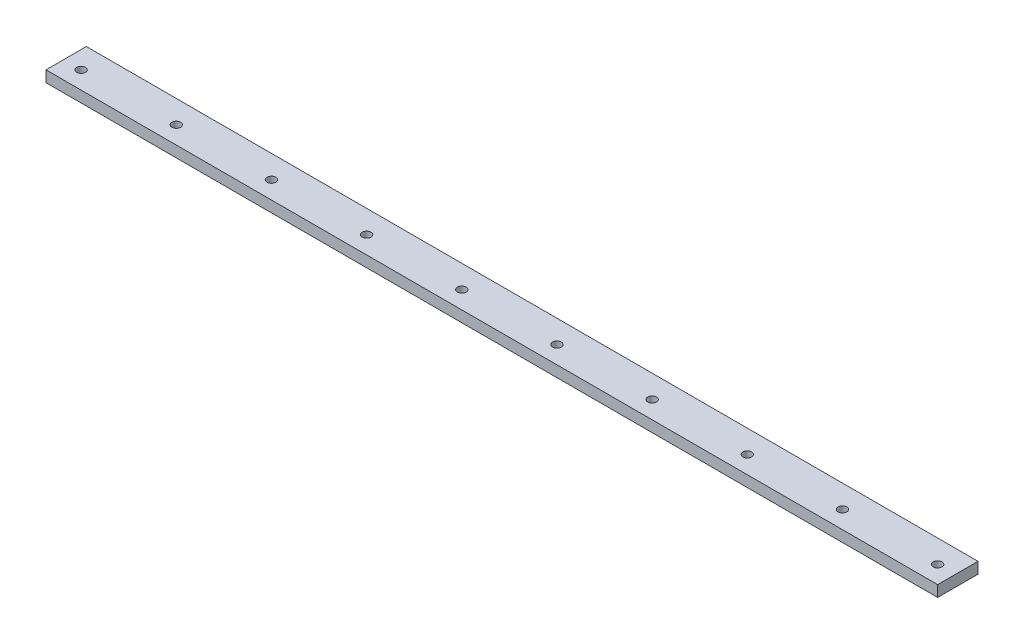
ISO-10303-21;
HEADER;
FILE_DESCRIPTION(('STEP AP214'),'2;1');
FILE_NAME('part.step','',(''),(''),'','','');
FILE_SCHEMA(('AUTOMOTIVE_DESIGN { 1 0 10303 214 1 1 1 1 }'));
ENDSEC;
DATA;
#1=APPLICATION_CONTEXT('core data for automotive mechanical design processes');
#2=APPLICATION_PROTOCOL_DEFINITION('international standard','automotive_design',2000,#1);
#3=PRODUCT_CONTEXT('',#1,'mechanical');
#4=PRODUCT('Part','Part','',(#3));
#5=PRODUCT_RELATED_PRODUCT_CATEGORY('part','',(#4));
#6=PRODUCT_DEFINITION_FORMATION('','',#4);
#7=PRODUCT_DEFINITION_CONTEXT('part definition',#1,'design');
#8=PRODUCT_DEFINITION('design','',#6,#7);
#9=PRODUCT_DEFINITION_SHAPE('','',#8);
#10=(LENGTH_UNIT() NAMED_UNIT(*) SI_UNIT(.MILLI.,.METRE.));
#11=(NAMED_UNIT(*) PLANE_ANGLE_UNIT() SI_UNIT($,.RADIAN.));
#12=(NAMED_UNIT(*) SI_UNIT($,.STERADIAN.) SOLID_ANGLE_UNIT());
#13=UNCERTAINTY_MEASURE_WITH_UNIT(LENGTH_MEASURE(1.E-05),#10,'distance_accuracy_value','');
#14=(GEOMETRIC_REPRESENTATION_CONTEXT(3) GLOBAL_UNCERTAINTY_ASSIGNED_CONTEXT((#13)) GLOBAL_UNIT_ASSIGNED_CONTEXT((#10,
#11,#12)) REPRESENTATION_CONTEXT('',''));
#15=CARTESIAN_POINT('',(0.,0.,0.));
#16=DIRECTION('',(0.,0.,1.));
#17=DIRECTION('',(1.,0.,0.));
#18=AXIS2_PLACEMENT_3D('',#15,#16,#17);
#19=CARTESIAN_POINT('',(0.,3.175,0.));
#20=DIRECTION('',(0.,-1.,0.));
#21=DIRECTION('',(0.,0.,-1.));
#22=AXIS2_PLACEMENT_3D('',#19,#20,#21);
#23=PLANE('',#22);
#24=DIRECTION('',(0.,0.,1.));
#25=VECTOR('',#24,1.);
#26=CARTESIAN_POINT('',(-254.,3.175,10.));
#27=LINE('',#26,#25);
#28=CARTESIAN_POINT('',(-254.,3.175,-13.));
#29=VERTEX_POINT('',#28);
#30=CARTESIAN_POINT('',(-254.,3.175,10.));
#31=VERTEX_POINT('',#30);
#32=EDGE_CURVE('E85',#29,#31,#27,.T.);
#33=ORIENTED_EDGE('',*,*,#32,.T.);
#34=DIRECTION('',(1.,0.,0.));
#35=VECTOR('',#34,1.);
#36=CARTESIAN_POINT('',(-254.,3.175,10.));
#37=LINE('',#36,#35);
#38=CARTESIAN_POINT('',(254.,3.175,10.0000000000001));
#39=VERTEX_POINT('',#38);
#40=EDGE_CURVE('E80',#31,#39,#37,.T.);
#41=ORIENTED_EDGE('',*,*,#40,.T.);
#42=DIRECTION('',(0.,0.,-1.));
#43=VECTOR('',#42,1.);
#44=CARTESIAN_POINT('',(254.,3.175,10.0000000000001));
#45=LINE('',#44,#43);
#46=CARTESIAN_POINT('',(254.,3.175,-13.));
#47=VERTEX_POINT('',#46);
#48=EDGE_CURVE('E83',#39,#47,#45,.T.);
#49=ORIENTED_EDGE('',*,*,#48,.T.);
#50=DIRECTION('',(-1.,0.,0.));
#51=VECTOR('',#50,1.);
#52=CARTESIAN_POINT('',(-254.,3.175,-13.));
#53=LINE('',#52,#51);
#54=EDGE_CURVE('E50',#47,#29,#53,.T.);
#55=ORIENTED_EDGE('',*,*,#54,.T.);
#56=EDGE_LOOP('',(#33,#41,#49,#55));
#57=FACE_BOUND('',#56,.T.);
#58=CARTESIAN_POINT('',(-244.,3.175,0.));
#59=DIRECTION('',(0.,1.,0.));
#60=DIRECTION('',(0.,0.,1.));
#61=AXIS2_PLACEMENT_3D('',#58,#59,#60);
#62=CIRCLE('',#61,2.5);
#63=CARTESIAN_POINT('',(-244.,3.175,2.49999999999999));
#64=VERTEX_POINT('',#63);
#65=EDGE_CURVE('E100',#64,#64,#62,.T.);
#66=ORIENTED_EDGE('',*,*,#65,.F.);
#67=EDGE_LOOP('',(#66));
#68=FACE_BOUND('',#67,.T.);
#69=CARTESIAN_POINT('',(-189.777777777778,3.175,0.));
#70=DIRECTION('',(0.,1.,0.));
#71=DIRECTION('',(0.,0.,1.));
#72=AXIS2_PLACEMENT_3D('',#69,#70,#71);
#73=CIRCLE('',#72,2.49999999999997);
#74=CARTESIAN_POINT('',(-189.777777777778,3.175,2.49999999999997));
#75=VERTEX_POINT('',#74);
#76=EDGE_CURVE('E115',#75,#75,#73,.T.);
#77=ORIENTED_EDGE('',*,*,#76,.F.);
#78=EDGE_LOOP('',(#77));
#79=FACE_BOUND('',#78,.T.);
#80=CARTESIAN_POINT('',(-135.555555555556,3.175,0.));
#81=DIRECTION('',(0.,1.,0.));
#82=DIRECTION('',(0.,0.,1.));
#83=AXIS2_PLACEMENT_3D('',#80,#81,#82);
#84=CIRCLE('',#83,2.5);
#85=CARTESIAN_POINT('',(-135.555555555556,3.175,2.49999999999999));
#86=VERTEX_POINT('',#85);
#87=EDGE_CURVE('E121',#86,#86,#84,.T.);
#88=ORIENTED_EDGE('',*,*,#87,.F.);
#89=EDGE_LOOP('',(#88));
#90=FACE_BOUND('',#89,.T.);
#91=CARTESIAN_POINT('',(-81.3333333333333,3.175,0.));
#92=DIRECTION('',(0.,1.,0.));
#93=DIRECTION('',(0.,0.,1.));
#94=AXIS2_PLACEMENT_3D('',#91,#92,#93);
#95=CIRCLE('',#94,2.5);
#96=CARTESIAN_POINT('',(-81.3333333333333,3.175,2.49999999999999));
#97=VERTEX_POINT('',#96);
#98=EDGE_CURVE('E127',#97,#97,#95,.T.);
#99=ORIENTED_EDGE('',*,*,#98,.F.);
#100=EDGE_LOOP('',(#99));
#101=FACE_BOUND('',#100,.T.);
#102=CARTESIAN_POINT('',(-27.1111111111111,3.175,0.));
#103=DIRECTION('',(0.,1.,0.));
#104=DIRECTION('',(0.,0.,1.));
#105=AXIS2_PLACEMENT_3D('',#102,#103,#104);
#106=CIRCLE('',#105,2.49999999999999);
#107=CARTESIAN_POINT('',(-27.1111111111111,3.175,2.49999999999999));
#108=VERTEX_POINT('',#107);
#109=EDGE_CURVE('E133',#108,#108,#106,.T.);
#110=ORIENTED_EDGE('',*,*,#109,.F.);
#111=EDGE_LOOP('',(#110));
#112=FACE_BOUND('',#111,.T.);
#113=CARTESIAN_POINT('',(27.1111111111111,3.175,0.));
#114=DIRECTION('',(0.,1.,0.));
#115=DIRECTION('',(0.,0.,1.));
#116=AXIS2_PLACEMENT_3D('',#113,#114,#115);
#117=CIRCLE('',#116,2.49999999999999);
#118=CARTESIAN_POINT('',(27.1111111111111,3.175,2.49999999999999));
#119=VERTEX_POINT('',#118);
#120=EDGE_CURVE('E139',#119,#119,#117,.T.);
#121=ORIENTED_EDGE('',*,*,#120,.F.);
#122=EDGE_LOOP('',(#121));
#123=FACE_BOUND('',#122,.T.);
#124=CARTESIAN_POINT('',(81.3333333333333,3.175,0.));
#125=DIRECTION('',(0.,1.,0.));
#126=DIRECTION('',(0.,0.,1.));
#127=AXIS2_PLACEMENT_3D('',#124,#125,#126);
#128=CIRCLE('',#127,2.5);
#129=CARTESIAN_POINT('',(81.3333333333333,3.175,2.49999999999999));
#130=VERTEX_POINT('',#129);
#131=EDGE_CURVE('E145',#130,#130,#128,.T.);
#132=ORIENTED_EDGE('',*,*,#131,.F.);
#133=EDGE_LOOP('',(#132));
#134=FACE_BOUND('',#133,.T.);
#135=CARTESIAN_POINT('',(135.555555555556,3.175,0.));
#136=DIRECTION('',(0.,1.,0.));
#137=DIRECTION('',(0.,0.,1.));
#138=AXIS2_PLACEMENT_3D('',#135,#136,#137);
#139=CIRCLE('',#138,2.5);
#140=CARTESIAN_POINT('',(135.555555555556,3.175,2.49999999999999));
#141=VERTEX_POINT('',#140);
#142=EDGE_CURVE('E151',#141,#141,#139,.T.);
#143=ORIENTED_EDGE('',*,*,#142,.F.);
#144=EDGE_LOOP('',(#143));
#145=FACE_BOUND('',#144,.T.);
#146=CARTESIAN_POINT('',(189.777777777778,3.175,0.));
#147=DIRECTION('',(0.,1.,0.));
#148=DIRECTION('',(0.,0.,1.));
#149=AXIS2_PLACEMENT_3D('',#146,#147,#148);
#150=CIRCLE('',#149,2.5);
#151=CARTESIAN_POINT('',(189.777777777778,3.175,2.49999999999999));
#152=VERTEX_POINT('',#151);
#153=EDGE_CURVE('E157',#152,#152,#150,.T.);
#154=ORIENTED_EDGE('',*,*,#153,.F.);
#155=EDGE_LOOP('',(#154));
#156=FACE_BOUND('',#155,.T.);
#157=CARTESIAN_POINT('',(244.,3.175,0.));
#158=DIRECTION('',(0.,1.,0.));
#159=DIRECTION('',(0.,0.,1.));
#160=AXIS2_PLACEMENT_3D('',#157,#158,#159);
#161=CIRCLE('',#160,2.5);
#162=CARTESIAN_POINT('',(244.,3.175,2.49999999999999));
#163=VERTEX_POINT('',#162);
#164=EDGE_CURVE('E163',#163,#163,#161,.T.);
#165=ORIENTED_EDGE('',*,*,#164,.F.);
#166=EDGE_LOOP('',(#165));
#167=FACE_BOUND('',#166,.T.);
#168=ADVANCED_FACE('F33',(#57,#68,#79,#90,#101,#112,#123,#134,#145,#156,#167),#23,.F.);
#169=CARTESIAN_POINT('',(0.,-3.175,0.));
#170=DIRECTION('',(0.,-1.,0.));
#171=DIRECTION('',(0.,0.,-1.));
#172=AXIS2_PLACEMENT_3D('',#169,#170,#171);
#173=PLANE('',#172);
#174=CARTESIAN_POINT('',(189.777777777778,-3.175,0.));
#175=DIRECTION('',(0.,1.,0.));
#176=DIRECTION('',(0.,0.,1.));
#177=AXIS2_PLACEMENT_3D('',#174,#175,#176);
#178=CIRCLE('',#177,2.5);
#179=CARTESIAN_POINT('',(189.777777777778,-3.175,2.49999999999999));
#180=VERTEX_POINT('',#179);
#181=EDGE_CURVE('E160',#180,#180,#178,.T.);
#182=ORIENTED_EDGE('',*,*,#181,.T.);
#183=EDGE_LOOP('',(#182));
#184=FACE_BOUND('',#183,.T.);
#185=CARTESIAN_POINT('',(81.3333333333333,-3.175,0.));
#186=DIRECTION('',(0.,1.,0.));
#187=DIRECTION('',(0.,0.,1.));
#188=AXIS2_PLACEMENT_3D('',#185,#186,#187);
#189=CIRCLE('',#188,2.5);
#190=CARTESIAN_POINT('',(81.3333333333333,-3.175,2.49999999999999));
#191=VERTEX_POINT('',#190);
#192=EDGE_CURVE('E148',#191,#191,#189,.T.);
#193=ORIENTED_EDGE('',*,*,#192,.T.);
#194=EDGE_LOOP('',(#193));
#195=FACE_BOUND('',#194,.T.);
#196=CARTESIAN_POINT('',(-27.1111111111111,-3.175,0.));
#197=DIRECTION('',(0.,1.,0.));
#198=DIRECTION('',(0.,0.,1.));
#199=AXIS2_PLACEMENT_3D('',#196,#197,#198);
#200=CIRCLE('',#199,2.49999999999999);
#201=CARTESIAN_POINT('',(-27.1111111111111,-3.175,2.49999999999999));
#202=VERTEX_POINT('',#201);
#203=EDGE_CURVE('E136',#202,#202,#200,.T.);
#204=ORIENTED_EDGE('',*,*,#203,.T.);
#205=EDGE_LOOP('',(#204));
#206=FACE_BOUND('',#205,.T.);
#207=CARTESIAN_POINT('',(-135.555555555556,-3.175,0.));
#208=DIRECTION('',(0.,1.,0.));
#209=DIRECTION('',(0.,0.,1.));
#210=AXIS2_PLACEMENT_3D('',#207,#208,#209);
#211=CIRCLE('',#210,2.5);
#212=CARTESIAN_POINT('',(-135.555555555556,-3.175,2.49999999999999));
#213=VERTEX_POINT('',#212);
#214=EDGE_CURVE('E124',#213,#213,#211,.T.);
#215=ORIENTED_EDGE('',*,*,#214,.T.);
#216=EDGE_LOOP('',(#215));
#217=FACE_BOUND('',#216,.T.);
#218=CARTESIAN_POINT('',(-244.,-3.175,0.));
#219=DIRECTION('',(0.,1.,0.));
#220=DIRECTION('',(0.,0.,1.));
#221=AXIS2_PLACEMENT_3D('',#218,#219,#220);
#222=CIRCLE('',#221,2.5);
#223=CARTESIAN_POINT('',(-244.,-3.175,2.49999999999999));
#224=VERTEX_POINT('',#223);
#225=EDGE_CURVE('E112',#224,#224,#222,.T.);
#226=ORIENTED_EDGE('',*,*,#225,.T.);
#227=EDGE_LOOP('',(#226));
#228=FACE_BOUND('',#227,.T.);
#229=DIRECTION('',(0.,0.,1.));
#230=VECTOR('',#229,1.);
#231=CARTESIAN_POINT('',(-254.,-3.175,10.));
#232=LINE('',#231,#230);
#233=CARTESIAN_POINT('',(-254.,-3.175,-13.));
#234=VERTEX_POINT('',#233);
#235=CARTESIAN_POINT('',(-254.,-3.175,10.));
#236=VERTEX_POINT('',#235);
#237=EDGE_CURVE('E97',#234,#236,#232,.T.);
#238=ORIENTED_EDGE('',*,*,#237,.F.);
#239=DIRECTION('',(-1.,0.,0.));
#240=VECTOR('',#239,1.);
#241=CARTESIAN_POINT('',(-254.,-3.175,-13.));
#242=LINE('',#241,#240);
#243=CARTESIAN_POINT('',(254.,-3.175,-13.));
#244=VERTEX_POINT('',#243);
#245=EDGE_CURVE('E73',#244,#234,#242,.T.);
#246=ORIENTED_EDGE('',*,*,#245,.F.);
#247=DIRECTION('',(0.,0.,-1.));
#248=VECTOR('',#247,1.);
#249=CARTESIAN_POINT('',(254.,-3.175,10.0000000000001));
#250=LINE('',#249,#248);
#251=CARTESIAN_POINT('',(254.,-3.175,10.0000000000001));
#252=VERTEX_POINT('',#251);
#253=EDGE_CURVE('E67',#252,#244,#250,.T.);
#254=ORIENTED_EDGE('',*,*,#253,.F.);
#255=DIRECTION('',(1.,0.,0.));
#256=VECTOR('',#255,1.);
#257=CARTESIAN_POINT('',(-254.,-3.175,10.));
#258=LINE('',#257,#256);
#259=EDGE_CURVE('E89',#236,#252,#258,.T.);
#260=ORIENTED_EDGE('',*,*,#259,.F.);
#261=EDGE_LOOP('',(#238,#246,#254,#260));
#262=FACE_BOUND('',#261,.T.);
#263=CARTESIAN_POINT('',(-189.777777777778,-3.175,0.));
#264=DIRECTION('',(0.,1.,0.));
#265=DIRECTION('',(0.,0.,1.));
#266=AXIS2_PLACEMENT_3D('',#263,#264,#265);
#267=CIRCLE('',#266,2.49999999999997);
#268=CARTESIAN_POINT('',(-189.777777777778,-3.175,2.49999999999997));
#269=VERTEX_POINT('',#268);
#270=EDGE_CURVE('E118',#269,#269,#267,.T.);
#271=ORIENTED_EDGE('',*,*,#270,.T.);
#272=EDGE_LOOP('',(#271));
#273=FACE_BOUND('',#272,.T.);
#274=CARTESIAN_POINT('',(-81.3333333333333,-3.175,0.));
#275=DIRECTION('',(0.,1.,0.));
#276=DIRECTION('',(0.,0.,1.));
#277=AXIS2_PLACEMENT_3D('',#274,#275,#276);
#278=CIRCLE('',#277,2.5);
#279=CARTESIAN_POINT('',(-81.3333333333333,-3.175,2.49999999999999));
#280=VERTEX_POINT('',#279);
#281=EDGE_CURVE('E130',#280,#280,#278,.T.);
#282=ORIENTED_EDGE('',*,*,#281,.T.);
#283=EDGE_LOOP('',(#282));
#284=FACE_BOUND('',#283,.T.);
#285=CARTESIAN_POINT('',(27.1111111111111,-3.175,0.));
#286=DIRECTION('',(0.,1.,0.));
#287=DIRECTION('',(0.,0.,1.));
#288=AXIS2_PLACEMENT_3D('',#285,#286,#287);
#289=CIRCLE('',#288,2.49999999999999);
#290=CARTESIAN_POINT('',(27.1111111111111,-3.175,2.49999999999999));
#291=VERTEX_POINT('',#290);
#292=EDGE_CURVE('E142',#291,#291,#289,.T.);
#293=ORIENTED_EDGE('',*,*,#292,.T.);
#294=EDGE_LOOP('',(#293));
#295=FACE_BOUND('',#294,.T.);
#296=CARTESIAN_POINT('',(135.555555555556,-3.175,0.));
#297=DIRECTION('',(0.,1.,0.));
#298=DIRECTION('',(0.,0.,1.));
#299=AXIS2_PLACEMENT_3D('',#296,#297,#298);
#300=CIRCLE('',#299,2.5);
#301=CARTESIAN_POINT('',(135.555555555556,-3.175,2.49999999999999));
#302=VERTEX_POINT('',#301);
#303=EDGE_CURVE('E154',#302,#302,#300,.T.);
#304=ORIENTED_EDGE('',*,*,#303,.T.);
#305=EDGE_LOOP('',(#304));
#306=FACE_BOUND('',#305,.T.);
#307=CARTESIAN_POINT('',(244.,-3.175,0.));
#308=DIRECTION('',(0.,1.,0.));
#309=DIRECTION('',(0.,0.,1.));
#310=AXIS2_PLACEMENT_3D('',#307,#308,#309);
#311=CIRCLE('',#310,2.5);
#312=CARTESIAN_POINT('',(244.,-3.175,2.49999999999999));
#313=VERTEX_POINT('',#312);
#314=EDGE_CURVE('E166',#313,#313,#311,.T.);
#315=ORIENTED_EDGE('',*,*,#314,.T.);
#316=EDGE_LOOP('',(#315));
#317=FACE_BOUND('',#316,.T.);
#318=ADVANCED_FACE('F108',(#184,#195,#206,#217,#228,#262,#273,#284,#295,#306,#317),#173,.T.);
#319=CARTESIAN_POINT('',(-254.,3.175,10.));
#320=DIRECTION('',(1.,0.,0.));
#321=DIRECTION('',(0.,0.,-1.));
#322=AXIS2_PLACEMENT_3D('',#319,#320,#321);
#323=PLANE('',#322);
#324=ORIENTED_EDGE('',*,*,#237,.T.);
#325=DIRECTION('',(0.,-1.,0.));
#326=VECTOR('',#325,1.);
#327=CARTESIAN_POINT('',(-254.,3.175,10.));
#328=LINE('',#327,#326);
#329=EDGE_CURVE('E11',#31,#236,#328,.T.);
#330=ORIENTED_EDGE('',*,*,#329,.F.);
#331=ORIENTED_EDGE('',*,*,#32,.F.);
#332=DIRECTION('',(0.,-1.,0.));
#333=VECTOR('',#332,1.);
#334=CARTESIAN_POINT('',(-254.,3.175,-13.));
#335=LINE('',#334,#333);
#336=EDGE_CURVE('E93',#29,#234,#335,.T.);
#337=ORIENTED_EDGE('',*,*,#336,.T.);
#338=EDGE_LOOP('',(#324,#330,#331,#337));
#339=FACE_BOUND('',#338,.T.);
#340=ADVANCED_FACE('F35',(#339),#323,.F.);
#341=CARTESIAN_POINT('',(-254.,3.175,10.));
#342=DIRECTION('',(0.,0.,-1.));
#343=DIRECTION('',(-1.,0.,0.));
#344=AXIS2_PLACEMENT_3D('',#341,#342,#343);
#345=PLANE('',#344);
#346=ORIENTED_EDGE('',*,*,#259,.T.);
#347=DIRECTION('',(0.,-1.,0.));
#348=VECTOR('',#347,1.);
#349=CARTESIAN_POINT('',(254.,3.175,10.0000000000001));
#350=LINE('',#349,#348);
#351=EDGE_CURVE('E42',#39,#252,#350,.T.);
#352=ORIENTED_EDGE('',*,*,#351,.F.);
#353=ORIENTED_EDGE('',*,*,#40,.F.);
#354=ORIENTED_EDGE('',*,*,#329,.T.);
#355=EDGE_LOOP('',(#346,#352,#353,#354));
#356=FACE_BOUND('',#355,.T.);
#357=ADVANCED_FACE('F88',(#356),#345,.F.);
#358=CARTESIAN_POINT('',(254.,3.175,10.0000000000001));
#359=DIRECTION('',(-1.,0.,0.));
#360=DIRECTION('',(0.,0.,1.));
#361=AXIS2_PLACEMENT_3D('',#358,#359,#360);
#362=PLANE('',#361);
#363=ORIENTED_EDGE('',*,*,#253,.T.);
#364=DIRECTION('',(0.,-1.,0.));
#365=VECTOR('',#364,1.);
#366=CARTESIAN_POINT('',(254.,3.175,-13.));
#367=LINE('',#366,#365);
#368=EDGE_CURVE('E90',#47,#244,#367,.T.);
#369=ORIENTED_EDGE('',*,*,#368,.F.);
#370=ORIENTED_EDGE('',*,*,#48,.F.);
#371=ORIENTED_EDGE('',*,*,#351,.T.);
#372=EDGE_LOOP('',(#363,#369,#370,#371));
#373=FACE_BOUND('',#372,.T.);
#374=ADVANCED_FACE('F91',(#373),#362,.F.);
#375=CARTESIAN_POINT('',(-254.,3.175,-13.));
#376=DIRECTION('',(0.,0.,1.));
#377=DIRECTION('',(1.,0.,0.));
#378=AXIS2_PLACEMENT_3D('',#375,#376,#377);
#379=PLANE('',#378);
#380=ORIENTED_EDGE('',*,*,#245,.T.);
#381=ORIENTED_EDGE('',*,*,#336,.F.);
#382=ORIENTED_EDGE('',*,*,#54,.F.);
#383=ORIENTED_EDGE('',*,*,#368,.T.);
#384=EDGE_LOOP('',(#380,#381,#382,#383));
#385=FACE_BOUND('',#384,.T.);
#386=ADVANCED_FACE('F105',(#385),#379,.F.);
#387=CARTESIAN_POINT('',(-244.,3.175,0.));
#388=DIRECTION('',(0.,-1.,0.));
#389=DIRECTION('',(0.,0.,-1.));
#390=AXIS2_PLACEMENT_3D('',#387,#388,#389);
#391=CYLINDRICAL_SURFACE('',#390,2.5);
#392=ORIENTED_EDGE('',*,*,#65,.T.);
#393=EDGE_LOOP('',(#392));
#394=FACE_BOUND('',#393,.T.);
#395=ORIENTED_EDGE('',*,*,#225,.F.);
#396=EDGE_LOOP('',(#395));
#397=FACE_BOUND('',#396,.T.);
#398=ADVANCED_FACE('F183',(#394,#397),#391,.F.);
#399=CARTESIAN_POINT('',(-189.777777777778,3.175,0.));
#400=DIRECTION('',(0.,-1.,0.));
#401=DIRECTION('',(0.,0.,-1.));
#402=AXIS2_PLACEMENT_3D('',#399,#400,#401);
#403=CYLINDRICAL_SURFACE('',#402,2.49999999999997);
#404=ORIENTED_EDGE('',*,*,#76,.T.);
#405=EDGE_LOOP('',(#404));
#406=FACE_BOUND('',#405,.T.);
#407=ORIENTED_EDGE('',*,*,#270,.F.);
#408=EDGE_LOOP('',(#407));
#409=FACE_BOUND('',#408,.T.);
#410=ADVANCED_FACE('F229',(#406,#409),#403,.F.);
#411=CARTESIAN_POINT('',(-135.555555555556,3.175,0.));
#412=DIRECTION('',(0.,-1.,0.));
#413=DIRECTION('',(0.,0.,-1.));
#414=AXIS2_PLACEMENT_3D('',#411,#412,#413);
#415=CYLINDRICAL_SURFACE('',#414,2.5);
#416=ORIENTED_EDGE('',*,*,#87,.T.);
#417=EDGE_LOOP('',(#416));
#418=FACE_BOUND('',#417,.T.);
#419=ORIENTED_EDGE('',*,*,#214,.F.);
#420=EDGE_LOOP('',(#419));
#421=FACE_BOUND('',#420,.T.);
#422=ADVANCED_FACE('F237',(#418,#421),#415,.F.);
#423=CARTESIAN_POINT('',(-81.3333333333333,3.175,0.));
#424=DIRECTION('',(0.,-1.,0.));
#425=DIRECTION('',(0.,0.,-1.));
#426=AXIS2_PLACEMENT_3D('',#423,#424,#425);
#427=CYLINDRICAL_SURFACE('',#426,2.5);
#428=ORIENTED_EDGE('',*,*,#98,.T.);
#429=EDGE_LOOP('',(#428));
#430=FACE_BOUND('',#429,.T.);
#431=ORIENTED_EDGE('',*,*,#281,.F.);
#432=EDGE_LOOP('',(#431));
#433=FACE_BOUND('',#432,.T.);
#434=ADVANCED_FACE('F245',(#430,#433),#427,.F.);
#435=CARTESIAN_POINT('',(-27.1111111111111,3.175,0.));
#436=DIRECTION('',(0.,-1.,0.));
#437=DIRECTION('',(0.,0.,-1.));
#438=AXIS2_PLACEMENT_3D('',#435,#436,#437);
#439=CYLINDRICAL_SURFACE('',#438,2.49999999999999);
#440=ORIENTED_EDGE('',*,*,#109,.T.);
#441=EDGE_LOOP('',(#440));
#442=FACE_BOUND('',#441,.T.);
#443=ORIENTED_EDGE('',*,*,#203,.F.);
#444=EDGE_LOOP('',(#443));
#445=FACE_BOUND('',#444,.T.);
#446=ADVANCED_FACE('F254',(#442,#445),#439,.F.);
#447=CARTESIAN_POINT('',(27.1111111111111,3.175,0.));
#448=DIRECTION('',(0.,-1.,0.));
#449=DIRECTION('',(0.,0.,-1.));
#450=AXIS2_PLACEMENT_3D('',#447,#448,#449);
#451=CYLINDRICAL_SURFACE('',#450,2.49999999999999);
#452=ORIENTED_EDGE('',*,*,#120,.T.);
#453=EDGE_LOOP('',(#452));
#454=FACE_BOUND('',#453,.T.);
#455=ORIENTED_EDGE('',*,*,#292,.F.);
#456=EDGE_LOOP('',(#455));
#457=FACE_BOUND('',#456,.T.);
#458=ADVANCED_FACE('F263',(#454,#457),#451,.F.);
#459=CARTESIAN_POINT('',(81.3333333333333,3.175,0.));
#460=DIRECTION('',(0.,-1.,0.));
#461=DIRECTION('',(0.,0.,-1.));
#462=AXIS2_PLACEMENT_3D('',#459,#460,#461);
#463=CYLINDRICAL_SURFACE('',#462,2.5);
#464=ORIENTED_EDGE('',*,*,#131,.T.);
#465=EDGE_LOOP('',(#464));
#466=FACE_BOUND('',#465,.T.);
#467=ORIENTED_EDGE('',*,*,#192,.F.);
#468=EDGE_LOOP('',(#467));
#469=FACE_BOUND('',#468,.T.);
#470=ADVANCED_FACE('F272',(#466,#469),#463,.F.);
#471=CARTESIAN_POINT('',(135.555555555556,3.175,0.));
#472=DIRECTION('',(0.,-1.,0.));
#473=DIRECTION('',(0.,0.,-1.));
#474=AXIS2_PLACEMENT_3D('',#471,#472,#473);
#475=CYLINDRICAL_SURFACE('',#474,2.5);
#476=ORIENTED_EDGE('',*,*,#142,.T.);
#477=EDGE_LOOP('',(#476));
#478=FACE_BOUND('',#477,.T.);
#479=ORIENTED_EDGE('',*,*,#303,.F.);
#480=EDGE_LOOP('',(#479));
#481=FACE_BOUND('',#480,.T.);
#482=ADVANCED_FACE('F281',(#478,#481),#475,.F.);
#483=CARTESIAN_POINT('',(189.777777777778,3.175,0.));
#484=DIRECTION('',(0.,-1.,0.));
#485=DIRECTION('',(0.,0.,-1.));
#486=AXIS2_PLACEMENT_3D('',#483,#484,#485);
#487=CYLINDRICAL_SURFACE('',#486,2.5);
#488=ORIENTED_EDGE('',*,*,#153,.T.);
#489=EDGE_LOOP('',(#488));
#490=FACE_BOUND('',#489,.T.);
#491=ORIENTED_EDGE('',*,*,#181,.F.);
#492=EDGE_LOOP('',(#491));
#493=FACE_BOUND('',#492,.T.);
#494=ADVANCED_FACE('F290',(#490,#493),#487,.F.);
#495=CARTESIAN_POINT('',(244.,3.175,0.));
#496=DIRECTION('',(0.,-1.,0.));
#497=DIRECTION('',(0.,0.,-1.));
#498=AXIS2_PLACEMENT_3D('',#495,#496,#497);
#499=CYLINDRICAL_SURFACE('',#498,2.5);
#500=ORIENTED_EDGE('',*,*,#164,.T.);
#501=EDGE_LOOP('',(#500));
#502=FACE_BOUND('',#501,.T.);
#503=ORIENTED_EDGE('',*,*,#314,.F.);
#504=EDGE_LOOP('',(#503));
#505=FACE_BOUND('',#504,.T.);
#506=ADVANCED_FACE('F172',(#502,#505),#499,.F.);
#507=CLOSED_SHELL('',(#168,#318,#340,#357,#374,#386,#398,#410,#422,#434,#446,#458,#470,#482,
#494,#506));
#508=MANIFOLD_SOLID_BREP('B2',#507);
#509=ADVANCED_BREP_SHAPE_REPRESENTATION('',(#18,#508),#14);
#510=SHAPE_DEFINITION_REPRESENTATION(#9,#509);
ENDSEC;
END-ISO-10303-21;
